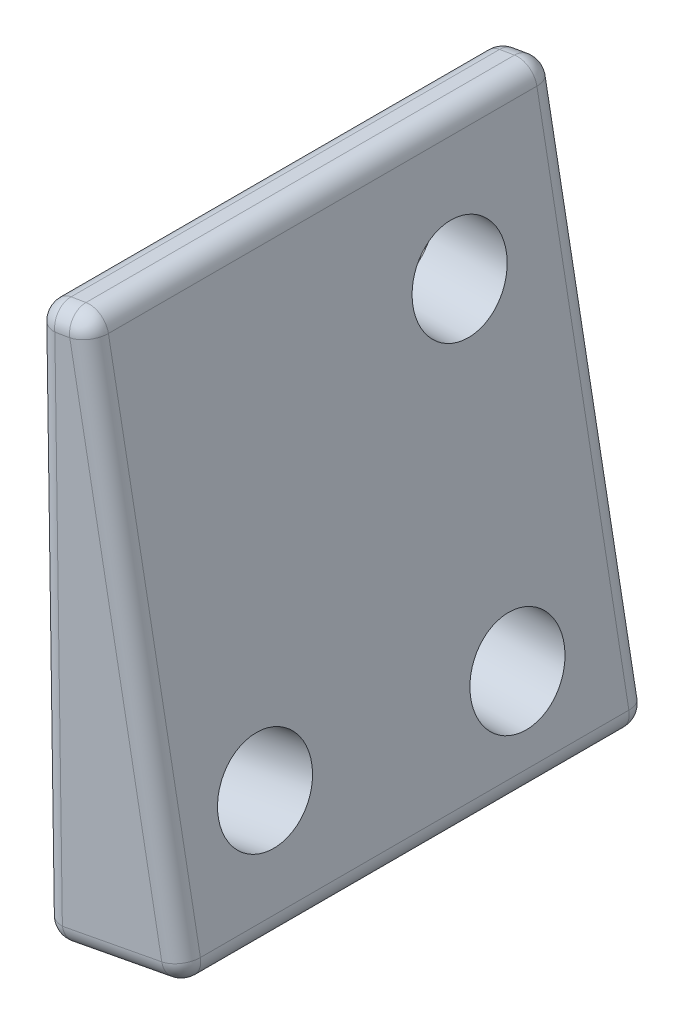
ISO-10303-21;
HEADER;
FILE_DESCRIPTION(('STEP AP214'),'2;1');
FILE_NAME('part.step','',(''),(''),'','','');
FILE_SCHEMA(('AUTOMOTIVE_DESIGN { 1 0 10303 214 1 1 1 1 }'));
ENDSEC;
DATA;
#1=APPLICATION_CONTEXT('core data for automotive mechanical design processes');
#2=APPLICATION_PROTOCOL_DEFINITION('international standard','automotive_design',2000,#1);
#3=PRODUCT_CONTEXT('',#1,'mechanical');
#4=PRODUCT('Part','Part','',(#3));
#5=PRODUCT_RELATED_PRODUCT_CATEGORY('part','',(#4));
#6=PRODUCT_DEFINITION_FORMATION('','',#4);
#7=PRODUCT_DEFINITION_CONTEXT('part definition',#1,'design');
#8=PRODUCT_DEFINITION('design','',#6,#7);
#9=PRODUCT_DEFINITION_SHAPE('','',#8);
#10=(LENGTH_UNIT() NAMED_UNIT(*) SI_UNIT(.MILLI.,.METRE.));
#11=(NAMED_UNIT(*) PLANE_ANGLE_UNIT() SI_UNIT($,.RADIAN.));
#12=(NAMED_UNIT(*) SI_UNIT($,.STERADIAN.) SOLID_ANGLE_UNIT());
#13=UNCERTAINTY_MEASURE_WITH_UNIT(LENGTH_MEASURE(1.E-05),#10,'distance_accuracy_value','');
#14=(GEOMETRIC_REPRESENTATION_CONTEXT(3) GLOBAL_UNCERTAINTY_ASSIGNED_CONTEXT((#13)) GLOBAL_UNIT_ASSIGNED_CONTEXT((#10,
#11,#12)) REPRESENTATION_CONTEXT('',''));
#15=CARTESIAN_POINT('',(0.,0.,0.));
#16=DIRECTION('',(0.,0.,1.));
#17=DIRECTION('',(1.,0.,0.));
#18=AXIS2_PLACEMENT_3D('',#15,#16,#17);
#19=CARTESIAN_POINT('',(0.,0.,9.525));
#20=DIRECTION('',(-0.186586678497619,0.982438502608294,0.));
#21=DIRECTION('',(-0.982438502608294,-0.186586678497619,0.));
#22=AXIS2_PLACEMENT_3D('',#19,#20,#21);
#23=PLANE('',#22);
#24=DIRECTION('',(0.,0.,-1.));
#25=VECTOR('',#24,1.);
#26=CARTESIAN_POINT('',(-0.776852208384602,-0.147541319747945,9.525));
#27=LINE('',#26,#25);
#28=CARTESIAN_POINT('',(-0.776852208384601,-0.147541319747945,-8.73125));
#29=VERTEX_POINT('',#28);
#30=CARTESIAN_POINT('',(-0.776852208384601,-0.147541319747945,8.73125));
#31=VERTEX_POINT('',#30);
#32=EDGE_CURVE('E220',#29,#31,#27,.F.);
#33=ORIENTED_EDGE('',*,*,#32,.T.);
#34=DIRECTION('',(0.982438502608294,0.186586678497619,0.));
#35=VECTOR('',#34,1.);
#36=CARTESIAN_POINT('',(-5.75504972665996,-1.09301051438357,8.73125));
#37=LINE('',#36,#35);
#38=CARTESIAN_POINT('',(-4.82718509807419,-0.91678861481061,8.73125));
#39=VERTEX_POINT('',#38);
#40=EDGE_CURVE('E223',#31,#39,#37,.F.);
#41=ORIENTED_EDGE('',*,*,#40,.T.);
#42=DIRECTION('',(0.,0.,-1.));
#43=VECTOR('',#42,1.);
#44=CARTESIAN_POINT('',(-4.82718509807419,-0.91678861481061,9.525));
#45=LINE('',#44,#43);
#46=CARTESIAN_POINT('',(-4.82718509807419,-0.91678861481061,-8.73125));
#47=VERTEX_POINT('',#46);
#48=EDGE_CURVE('E214',#39,#47,#45,.T.);
#49=ORIENTED_EDGE('',*,*,#48,.T.);
#50=DIRECTION('',(0.982438502608294,0.186586678497619,0.));
#51=VECTOR('',#50,1.);
#52=CARTESIAN_POINT('',(0.,0.,-8.73125));
#53=LINE('',#52,#51);
#54=EDGE_CURVE('E217',#47,#29,#53,.T.);
#55=ORIENTED_EDGE('',*,*,#54,.T.);
#56=EDGE_LOOP('',(#33,#41,#49,#55));
#57=FACE_BOUND('',#56,.T.);
#58=ADVANCED_FACE('F49',(#57),#23,.F.);
#59=CARTESIAN_POINT('',(-4.03527270589868,21.6965509629605,9.525));
#60=DIRECTION('',(-0.983140599238442,-0.182851202153765,0.));
#61=DIRECTION('',(0.182851202153765,-0.983140599238442,0.));
#62=AXIS2_PLACEMENT_3D('',#59,#60,#61);
#63=PLANE('',#62);
#64=DIRECTION('',(-0.182851202153765,0.983140599238442,0.));
#65=VECTOR('',#64,1.);
#66=CARTESIAN_POINT('',(-4.03527270589868,21.6965509629605,-8.73125));
#67=LINE('',#66,#65);
#68=CARTESIAN_POINT('',(-0.144587533796573,0.777407383406937,-8.73125));
#69=VERTEX_POINT('',#68);
#70=CARTESIAN_POINT('',(-3.89239666877288,20.9283458262037,-8.73125));
#71=VERTEX_POINT('',#70);
#72=EDGE_CURVE('E238',#69,#71,#67,.T.);
#73=ORIENTED_EDGE('',*,*,#72,.T.);
#74=DIRECTION('',(0.,0.,-1.));
#75=VECTOR('',#74,1.);
#76=CARTESIAN_POINT('',(-3.89239666877288,20.9283458262037,9.525));
#77=LINE('',#76,#75);
#78=CARTESIAN_POINT('',(-3.89239666877288,20.9283458262037,8.73125));
#79=VERTEX_POINT('',#78);
#80=EDGE_CURVE('E247',#71,#79,#77,.F.);
#81=ORIENTED_EDGE('',*,*,#80,.T.);
#82=DIRECTION('',(-0.182851202153765,0.983140599238442,0.));
#83=VECTOR('',#82,1.);
#84=CARTESIAN_POINT('',(0.,0.,8.73125));
#85=LINE('',#84,#83);
#86=CARTESIAN_POINT('',(-0.144587533796573,0.777407383406937,8.73125));
#87=VERTEX_POINT('',#86);
#88=EDGE_CURVE('E244',#79,#87,#85,.F.);
#89=ORIENTED_EDGE('',*,*,#88,.T.);
#90=DIRECTION('',(0.,0.,-1.));
#91=VECTOR('',#90,1.);
#92=CARTESIAN_POINT('',(-0.144587533796573,0.777407383406935,9.525));
#93=LINE('',#92,#91);
#94=EDGE_CURVE('E241',#87,#69,#93,.T.);
#95=ORIENTED_EDGE('',*,*,#94,.T.);
#96=EDGE_LOOP('',(#73,#81,#89,#95));
#97=FACE_BOUND('',#96,.T.);
#98=CARTESIAN_POINT('',(-0.862804348530857,4.63906156617351,5.37860381234904));
#99=DIRECTION('',(0.983140599238442,0.182851202153766,0.));
#100=DIRECTION('',(-0.182851202153766,0.983140599238442,0.));
#101=AXIS2_PLACEMENT_3D('',#98,#99,#100);
#102=CIRCLE('',#101,1.905);
#103=CARTESIAN_POINT('',(-1.21113588863378,6.51194440772274,5.37860381234904));
#104=VERTEX_POINT('',#103);
#105=EDGE_CURVE('E348',#104,#104,#102,.T.);
#106=ORIENTED_EDGE('',*,*,#105,.F.);
#107=EDGE_LOOP('',(#106));
#108=FACE_BOUND('',#107,.T.);
#109=CARTESIAN_POINT('',(-0.71672777584938,3.85364803041786,-4.7625));
#110=DIRECTION('',(-0.983140599238442,-0.182851202153765,0.));
#111=DIRECTION('',(-0.182851202153765,0.983140599238442,0.));
#112=AXIS2_PLACEMENT_3D('',#109,#110,#111);
#113=ELLIPSE('',#112,1.93258633249918,1.905);
#114=CARTESIAN_POINT('',(-1.07010351001279,5.75365211543113,-4.7625));
#115=VERTEX_POINT('',#114);
#116=EDGE_CURVE('E201',#115,#115,#113,.T.);
#117=ORIENTED_EDGE('',*,*,#116,.T.);
#118=EDGE_LOOP('',(#117));
#119=FACE_BOUND('',#118,.T.);
#120=CARTESIAN_POINT('',(-3.07256600360546,16.5203419305063,-4.7625));
#121=DIRECTION('',(-0.983140599238442,-0.182851202153765,0.));
#122=DIRECTION('',(-0.182851202153765,0.983140599238442,0.));
#123=AXIS2_PLACEMENT_3D('',#120,#121,#122);
#124=ELLIPSE('',#123,1.93258633249918,1.905);
#125=CARTESIAN_POINT('',(-3.42594173776887,18.4203460155196,-4.7625));
#126=VERTEX_POINT('',#125);
#127=EDGE_CURVE('E205',#126,#126,#124,.T.);
#128=ORIENTED_EDGE('',*,*,#127,.T.);
#129=EDGE_LOOP('',(#128));
#130=FACE_BOUND('',#129,.T.);
#131=ADVANCED_FACE('F373',(#97,#108,#119,#130),#63,.F.);
#132=CARTESIAN_POINT('',(-6.08542968309798,21.3484721947888,9.525));
#133=DIRECTION('',(0.16738614290036,-0.985891413475612,0.));
#134=DIRECTION('',(0.985891413475612,0.16738614290036,0.));
#135=AXIS2_PLACEMENT_3D('',#132,#133,#134);
#136=PLANE('',#135);
#137=DIRECTION('',(0.,0.,-1.));
#138=VECTOR('',#137,1.);
#139=CARTESIAN_POINT('',(-5.41461253164299,21.4623645505175,9.525));
#140=LINE('',#139,#138);
#141=CARTESIAN_POINT('',(-5.41461253164299,21.4623645505175,-8.73125));
#142=VERTEX_POINT('',#141);
#143=CARTESIAN_POINT('',(-5.41461253164299,21.4623645505175,8.73125));
#144=VERTEX_POINT('',#143);
#145=EDGE_CURVE('E227',#142,#144,#140,.F.);
#146=ORIENTED_EDGE('',*,*,#145,.T.);
#147=DIRECTION('',(-0.985891413475612,-0.16738614290036,0.));
#148=VECTOR('',#147,1.);
#149=CARTESIAN_POINT('',(-4.03527270589868,21.6965509629605,8.73125));
#150=LINE('',#149,#148);
#151=CARTESIAN_POINT('',(-4.80562727034556,21.5657589939404,8.73125));
#152=VERTEX_POINT('',#151);
#153=EDGE_CURVE('E180',#144,#152,#150,.F.);
#154=ORIENTED_EDGE('',*,*,#153,.T.);
#155=DIRECTION('',(0.,0.,-1.));
#156=VECTOR('',#155,1.);
#157=CARTESIAN_POINT('',(-4.80562727034556,21.5657589939404,9.525));
#158=LINE('',#157,#156);
#159=CARTESIAN_POINT('',(-4.80562727034556,21.5657589939404,-8.73125));
#160=VERTEX_POINT('',#159);
#161=EDGE_CURVE('E233',#152,#160,#158,.T.);
#162=ORIENTED_EDGE('',*,*,#161,.T.);
#163=DIRECTION('',(-0.985891413475612,-0.16738614290036,0.));
#164=VECTOR('',#163,1.);
#165=CARTESIAN_POINT('',(-6.08542968309798,21.3484721947888,-8.73125));
#166=LINE('',#165,#164);
#167=EDGE_CURVE('E230',#160,#142,#166,.T.);
#168=ORIENTED_EDGE('',*,*,#167,.T.);
#169=EDGE_LOOP('',(#146,#154,#162,#168));
#170=FACE_BOUND('',#169,.T.);
#171=ADVANCED_FACE('F400',(#170),#136,.F.);
#172=CARTESIAN_POINT('',(-5.75504972665996,-1.09301051438357,9.525));
#173=DIRECTION('',(0.999891651299871,0.0147202466289882,0.));
#174=DIRECTION('',(-0.0147202466289882,0.999891651299871,0.));
#175=AXIS2_PLACEMENT_3D('',#172,#173,#174);
#176=PLANE('',#175);
#177=DIRECTION('',(0.,0.,-1.));
#178=VECTOR('',#177,1.);
#179=CARTESIAN_POINT('',(-5.76895227235095,-0.148662249127036,9.525));
#180=LINE('',#179,#178);
#181=CARTESIAN_POINT('',(-5.76895227235095,-0.148662249127036,-8.73125));
#182=VERTEX_POINT('',#181);
#183=CARTESIAN_POINT('',(-5.76895227235095,-0.148662249127036,8.73125));
#184=VERTEX_POINT('',#183);
#185=EDGE_CURVE('E59',#182,#184,#180,.F.);
#186=ORIENTED_EDGE('',*,*,#185,.T.);
#187=DIRECTION('',(0.0147202466289882,-0.999891651299871,0.));
#188=VECTOR('',#187,1.);
#189=CARTESIAN_POINT('',(-6.08542968309798,21.3484721947888,8.73125));
#190=LINE('',#189,#188);
#191=CARTESIAN_POINT('',(-6.07541377893511,20.6681290453095,8.73125));
#192=VERTEX_POINT('',#191);
#193=EDGE_CURVE('E11',#184,#192,#190,.F.);
#194=ORIENTED_EDGE('',*,*,#193,.T.);
#195=DIRECTION('',(0.,0.,-1.));
#196=VECTOR('',#195,1.);
#197=CARTESIAN_POINT('',(-6.07541377893511,20.6681290453095,9.525));
#198=LINE('',#197,#196);
#199=CARTESIAN_POINT('',(-6.07541377893511,20.6681290453095,-8.73125));
#200=VERTEX_POINT('',#199);
#201=EDGE_CURVE('E264',#192,#200,#198,.T.);
#202=ORIENTED_EDGE('',*,*,#201,.T.);
#203=DIRECTION('',(0.0147202466289882,-0.999891651299871,0.));
#204=VECTOR('',#203,1.);
#205=CARTESIAN_POINT('',(-5.75504972665996,-1.09301051438357,-8.73125));
#206=LINE('',#205,#204);
#207=EDGE_CURVE('E75',#200,#182,#206,.T.);
#208=ORIENTED_EDGE('',*,*,#207,.T.);
#209=EDGE_LOOP('',(#186,#194,#202,#208));
#210=FACE_BOUND('',#209,.T.);
#211=CARTESIAN_POINT('',(-5.82584723241965,3.7160009598241,5.37860381234904));
#212=DIRECTION('',(0.999891651299871,0.0147202466289882,0.));
#213=DIRECTION('',(-0.0147202466289882,0.999891651299871,0.));
#214=AXIS2_PLACEMENT_3D('',#211,#212,#213);
#215=ELLIPSE('',#214,1.93258633249918,1.905);
#216=CARTESIAN_POINT('',(-5.85429537986585,5.64837789910626,5.37860381234904));
#217=VERTEX_POINT('',#216);
#218=EDGE_CURVE('E208',#217,#217,#215,.T.);
#219=ORIENTED_EDGE('',*,*,#218,.T.);
#220=EDGE_LOOP('',(#219));
#221=FACE_BOUND('',#220,.T.);
#222=CARTESIAN_POINT('',(-5.8267661387849,3.77841885444843,-4.7625));
#223=DIRECTION('',(-0.99989165129987,-0.0147202466289882,0.));
#224=DIRECTION('',(0.0147202466289882,-0.99989165129987,0.));
#225=AXIS2_PLACEMENT_3D('',#222,#223,#224);
#226=CIRCLE('',#225,1.905);
#227=CARTESIAN_POINT('',(-5.79872406895667,1.87362525872218,-4.7625));
#228=VERTEX_POINT('',#227);
#229=EDGE_CURVE('E362',#228,#228,#226,.T.);
#230=ORIENTED_EDGE('',*,*,#229,.F.);
#231=EDGE_LOOP('',(#230));
#232=FACE_BOUND('',#231,.T.);
#233=CARTESIAN_POINT('',(-6.01371327097305,16.4770428259568,-4.7625));
#234=DIRECTION('',(-0.99989165129987,-0.0147202466289882,0.));
#235=DIRECTION('',(0.0147202466289882,-0.99989165129987,0.));
#236=AXIS2_PLACEMENT_3D('',#233,#234,#235);
#237=CIRCLE('',#236,1.905);
#238=CARTESIAN_POINT('',(-5.98567120114482,14.5722492302305,-4.7625));
#239=VERTEX_POINT('',#238);
#240=EDGE_CURVE('E360',#239,#239,#237,.T.);
#241=ORIENTED_EDGE('',*,*,#240,.F.);
#242=EDGE_LOOP('',(#241));
#243=FACE_BOUND('',#242,.T.);
#244=ADVANCED_FACE('F506',(#210,#221,#232,#243),#176,.F.);
#245=CARTESIAN_POINT('',(0.,0.,9.525));
#246=DIRECTION('',(0.,0.,1.));
#247=DIRECTION('',(1.,0.,0.));
#248=AXIS2_PLACEMENT_3D('',#245,#246,#247);
#249=PLANE('',#248);
#250=DIRECTION('',(0.982438502608294,0.186586678497619,0.));
#251=VECTOR('',#250,1.);
#252=CARTESIAN_POINT('',(-0.148103176057485,0.779810561445333,9.525));
#253=LINE('',#252,#251);
#254=CARTESIAN_POINT('',(-4.97528827413168,-0.136978053365276,9.525));
#255=VERTEX_POINT('',#254);
#256=CARTESIAN_POINT('',(-0.924955384442086,0.632269241697388,9.525));
#257=VERTEX_POINT('',#256);
#258=EDGE_CURVE('E172',#255,#257,#253,.T.);
#259=ORIENTED_EDGE('',*,*,#258,.T.);
#260=DIRECTION('',(-0.182851202153765,0.983140599238442,0.));
#261=VECTOR('',#260,1.);
#262=CARTESIAN_POINT('',(-4.8156405565442,21.5514128212509,9.525));
#263=LINE('',#262,#261);
#264=CARTESIAN_POINT('',(-4.67276451941839,20.7832076844942,9.525));
#265=VERTEX_POINT('',#264);
#266=EDGE_CURVE('E167',#257,#265,#263,.T.);
#267=ORIENTED_EDGE('',*,*,#266,.T.);
#268=DIRECTION('',(-0.985891413475612,-0.16738614290036,0.));
#269=VECTOR('',#268,1.);
#270=CARTESIAN_POINT('',(-5.95256693217082,20.5659208853425,9.525));
#271=LINE('',#270,#269);
#272=CARTESIAN_POINT('',(-5.28174978071583,20.6798132410712,9.525));
#273=VERTEX_POINT('',#272);
#274=EDGE_CURVE('E159',#265,#273,#271,.T.);
#275=ORIENTED_EDGE('',*,*,#274,.T.);
#276=DIRECTION('',(0.0147202466289882,-0.99989165129987,0.));
#277=VECTOR('',#276,1.);
#278=CARTESIAN_POINT('',(-4.96138572844069,-1.08132631862181,9.525));
#279=LINE('',#278,#277);
#280=EDGE_CURVE('E164',#273,#255,#279,.T.);
#281=ORIENTED_EDGE('',*,*,#280,.T.);
#282=EDGE_LOOP('',(#259,#267,#275,#281));
#283=FACE_BOUND('',#282,.T.);
#284=ADVANCED_FACE('F162',(#283),#249,.T.);
#285=CARTESIAN_POINT('',(0.,0.,-9.525));
#286=DIRECTION('',(0.,0.,1.));
#287=DIRECTION('',(1.,0.,0.));
#288=AXIS2_PLACEMENT_3D('',#285,#286,#287);
#289=PLANE('',#288);
#290=DIRECTION('',(-0.985891413475612,-0.16738614290036,0.));
#291=VECTOR('',#290,1.);
#292=CARTESIAN_POINT('',(-3.56066180566553,20.972022173818,-9.525));
#293=LINE('',#292,#291);
#294=CARTESIAN_POINT('',(-5.28174978071583,20.6798132410712,-9.525));
#295=VERTEX_POINT('',#294);
#296=CARTESIAN_POINT('',(-4.67276451941839,20.7832076844942,-9.525));
#297=VERTEX_POINT('',#296);
#298=EDGE_CURVE('E257',#295,#297,#293,.F.);
#299=ORIENTED_EDGE('',*,*,#298,.T.);
#300=DIRECTION('',(-0.182851202153765,0.983140599238442,0.));
#301=VECTOR('',#300,1.);
#302=CARTESIAN_POINT('',(-0.780367850645513,-0.145138141709551,-9.525));
#303=LINE('',#302,#301);
#304=CARTESIAN_POINT('',(-0.924955384442087,0.632269241697387,-9.525));
#305=VERTEX_POINT('',#304);
#306=EDGE_CURVE('E261',#297,#305,#303,.F.);
#307=ORIENTED_EDGE('',*,*,#306,.T.);
#308=DIRECTION('',(0.982438502608294,0.186586678497619,0.));
#309=VECTOR('',#308,1.);
#310=CARTESIAN_POINT('',(-0.148103176057485,0.779810561445333,-9.525));
#311=LINE('',#310,#309);
#312=CARTESIAN_POINT('',(-4.97528827413168,-0.136978053365276,-9.525));
#313=VERTEX_POINT('',#312);
#314=EDGE_CURVE('E254',#305,#313,#311,.F.);
#315=ORIENTED_EDGE('',*,*,#314,.T.);
#316=DIRECTION('',(0.0147202466289882,-0.99989165129987,0.));
#317=VECTOR('',#316,1.);
#318=CARTESIAN_POINT('',(-4.97622633276355,-0.0732592164408187,-9.525));
#319=LINE('',#318,#317);
#320=EDGE_CURVE('E251',#313,#295,#319,.F.);
#321=ORIENTED_EDGE('',*,*,#320,.T.);
#322=EDGE_LOOP('',(#299,#307,#315,#321));
#323=FACE_BOUND('',#322,.T.);
#324=ADVANCED_FACE('F378',(#323),#289,.F.);
#325=CARTESIAN_POINT('',(0.0755210369288457,16.5666875696423,-4.7625));
#326=DIRECTION('',(-0.99989165129987,-0.0147202466289882,0.));
#327=DIRECTION('',(0.0147202466289882,-0.99989165129987,0.));
#328=AXIS2_PLACEMENT_3D('',#325,#326,#327);
#329=CYLINDRICAL_SURFACE('',#328,1.905);
#330=ORIENTED_EDGE('',*,*,#240,.T.);
#331=EDGE_LOOP('',(#330));
#332=FACE_BOUND('',#331,.T.);
#333=ORIENTED_EDGE('',*,*,#127,.F.);
#334=EDGE_LOOP('',(#333));
#335=FACE_BOUND('',#334,.T.);
#336=ADVANCED_FACE('F375',(#332,#335),#329,.F.);
#337=CARTESIAN_POINT('',(0.262468169116995,3.8680635981339,-4.7625));
#338=DIRECTION('',(-0.99989165129987,-0.0147202466289882,0.));
#339=DIRECTION('',(0.0147202466289882,-0.99989165129987,0.));
#340=AXIS2_PLACEMENT_3D('',#337,#338,#339);
#341=CYLINDRICAL_SURFACE('',#340,1.905);
#342=ORIENTED_EDGE('',*,*,#229,.T.);
#343=EDGE_LOOP('',(#342));
#344=FACE_BOUND('',#343,.T.);
#345=ORIENTED_EDGE('',*,*,#116,.F.);
#346=EDGE_LOOP('',(#345));
#347=FACE_BOUND('',#346,.T.);
#348=ADVANCED_FACE('F377',(#344,#347),#341,.F.);
#349=CARTESIAN_POINT('',(-6.94125915038092,3.50854903458183,5.37860381234904));
#350=DIRECTION('',(0.983140599238442,0.182851202153766,0.));
#351=DIRECTION('',(-0.182851202153766,0.983140599238442,0.));
#352=AXIS2_PLACEMENT_3D('',#349,#350,#351);
#353=CYLINDRICAL_SURFACE('',#352,1.905);
#354=ORIENTED_EDGE('',*,*,#105,.T.);
#355=EDGE_LOOP('',(#354));
#356=FACE_BOUND('',#355,.T.);
#357=ORIENTED_EDGE('',*,*,#218,.F.);
#358=EDGE_LOOP('',(#357));
#359=FACE_BOUND('',#358,.T.);
#360=ADVANCED_FACE('F385',(#356,#359),#353,.F.);
#361=CARTESIAN_POINT('',(-5.95256693217082,20.5659208853425,-8.73125));
#362=DIRECTION('',(-0.985891413475612,-0.16738614290036,0.));
#363=DIRECTION('',(0.16738614290036,-0.985891413475612,0.));
#364=AXIS2_PLACEMENT_3D('',#361,#362,#363);
#365=CYLINDRICAL_SURFACE('',#364,0.79375);
#366=CARTESIAN_POINT('',(-5.28174978071583,20.6798132410712,-8.73125));
#367=DIRECTION('',(-0.985891413475612,-0.16738614290036,0.));
#368=DIRECTION('',(0.16738614290036,-0.985891413475612,0.));
#369=AXIS2_PLACEMENT_3D('',#366,#367,#368);
#370=CIRCLE('',#369,0.79375);
#371=EDGE_CURVE('E53',#142,#295,#370,.T.);
#372=ORIENTED_EDGE('',*,*,#371,.F.);
#373=ORIENTED_EDGE('',*,*,#167,.F.);
#374=CARTESIAN_POINT('',(-4.67276451941839,20.7832076844942,-8.73125));
#375=DIRECTION('',(0.985891413475612,0.16738614290036,0.));
#376=DIRECTION('',(-0.16738614290036,0.985891413475612,0.));
#377=AXIS2_PLACEMENT_3D('',#374,#375,#376);
#378=CIRCLE('',#377,0.79375);
#379=EDGE_CURVE('E339',#297,#160,#378,.T.);
#380=ORIENTED_EDGE('',*,*,#379,.F.);
#381=ORIENTED_EDGE('',*,*,#298,.F.);
#382=EDGE_LOOP('',(#372,#373,#380,#381));
#383=FACE_BOUND('',#382,.T.);
#384=ADVANCED_FACE('F51',(#383),#365,.T.);
#385=CARTESIAN_POINT('',(-5.28174978071583,20.6798132410712,-8.73125));
#386=DIRECTION('',(0.,0.,-1.));
#387=DIRECTION('',(-1.,0.,0.));
#388=AXIS2_PLACEMENT_3D('',#385,#386,#387);
#389=SPHERICAL_SURFACE('',#388,0.79375);
#390=CARTESIAN_POINT('',(-5.28174978071583,20.6798132410712,-8.73125));
#391=DIRECTION('',(0.,0.,-1.));
#392=DIRECTION('',(-1.,0.,0.));
#393=AXIS2_PLACEMENT_3D('',#390,#391,#392);
#394=CIRCLE('',#393,0.79375);
#395=EDGE_CURVE('E332',#142,#200,#394,.F.);
#396=ORIENTED_EDGE('',*,*,#395,.F.);
#397=ORIENTED_EDGE('',*,*,#371,.T.);
#398=CARTESIAN_POINT('',(-5.28174978071583,20.6798132410712,-8.73125));
#399=DIRECTION('',(-0.0147202466289832,0.99989165129987,0.));
#400=DIRECTION('',(-0.999891651299871,-0.0147202466289832,0.));
#401=AXIS2_PLACEMENT_3D('',#398,#399,#400);
#402=CIRCLE('',#401,0.79375);
#403=EDGE_CURVE('E336',#200,#295,#402,.F.);
#404=ORIENTED_EDGE('',*,*,#403,.F.);
#405=EDGE_LOOP('',(#396,#397,#404));
#406=FACE_BOUND('',#405,.T.);
#407=ADVANCED_FACE('F469',(#406),#389,.T.);
#408=CARTESIAN_POINT('',(-4.67276451941839,20.7832076844942,-8.73125));
#409=DIRECTION('',(0.,0.,-1.));
#410=DIRECTION('',(-1.,0.,0.));
#411=AXIS2_PLACEMENT_3D('',#408,#409,#410);
#412=SPHERICAL_SURFACE('',#411,0.79375);
#413=CARTESIAN_POINT('',(-4.67276451941839,20.7832076844942,-8.73125));
#414=DIRECTION('',(-0.182851202153764,0.983140599238442,0.));
#415=DIRECTION('',(-0.983140599238442,-0.182851202153764,0.));
#416=AXIS2_PLACEMENT_3D('',#413,#414,#415);
#417=CIRCLE('',#416,0.79375);
#418=EDGE_CURVE('E324',#297,#71,#417,.F.);
#419=ORIENTED_EDGE('',*,*,#418,.F.);
#420=ORIENTED_EDGE('',*,*,#379,.T.);
#421=CARTESIAN_POINT('',(-4.67276451941839,20.7832076844942,-8.73125));
#422=DIRECTION('',(0.,0.,-1.));
#423=DIRECTION('',(-1.,0.,0.));
#424=AXIS2_PLACEMENT_3D('',#421,#422,#423);
#425=CIRCLE('',#424,0.79375);
#426=EDGE_CURVE('E328',#71,#160,#425,.F.);
#427=ORIENTED_EDGE('',*,*,#426,.F.);
#428=EDGE_LOOP('',(#419,#420,#427));
#429=FACE_BOUND('',#428,.T.);
#430=ADVANCED_FACE('F466',(#429),#412,.T.);
#431=CARTESIAN_POINT('',(-4.96138572844069,-1.08132631862181,-8.73125));
#432=DIRECTION('',(0.0147202466289882,-0.99989165129987,0.));
#433=DIRECTION('',(0.99989165129987,0.0147202466289882,0.));
#434=AXIS2_PLACEMENT_3D('',#431,#432,#433);
#435=CYLINDRICAL_SURFACE('',#434,0.79375);
#436=ORIENTED_EDGE('',*,*,#403,.T.);
#437=ORIENTED_EDGE('',*,*,#320,.F.);
#438=CARTESIAN_POINT('',(-4.97528827413168,-0.136978053365277,-8.73125));
#439=DIRECTION('',(0.0147202466289882,-0.99989165129987,0.));
#440=DIRECTION('',(0.99989165129987,0.0147202466289882,0.));
#441=AXIS2_PLACEMENT_3D('',#438,#439,#440);
#442=CIRCLE('',#441,0.79375);
#443=EDGE_CURVE('E316',#182,#313,#442,.T.);
#444=ORIENTED_EDGE('',*,*,#443,.F.);
#445=ORIENTED_EDGE('',*,*,#207,.F.);
#446=EDGE_LOOP('',(#436,#437,#444,#445));
#447=FACE_BOUND('',#446,.T.);
#448=ADVANCED_FACE('F462',(#447),#435,.T.);
#449=CARTESIAN_POINT('',(-5.28174978071583,20.6798132410712,9.525));
#450=DIRECTION('',(0.,0.,-1.));
#451=DIRECTION('',(-1.,0.,0.));
#452=AXIS2_PLACEMENT_3D('',#449,#450,#451);
#453=CYLINDRICAL_SURFACE('',#452,0.79375);
#454=ORIENTED_EDGE('',*,*,#395,.T.);
#455=ORIENTED_EDGE('',*,*,#201,.F.);
#456=CARTESIAN_POINT('',(-5.28174978071583,20.6798132410712,8.73125));
#457=DIRECTION('',(0.,0.,1.));
#458=DIRECTION('',(1.,0.,0.));
#459=AXIS2_PLACEMENT_3D('',#456,#457,#458);
#460=CIRCLE('',#459,0.79375);
#461=EDGE_CURVE('E185',#144,#192,#460,.T.);
#462=ORIENTED_EDGE('',*,*,#461,.F.);
#463=ORIENTED_EDGE('',*,*,#145,.F.);
#464=EDGE_LOOP('',(#454,#455,#462,#463));
#465=FACE_BOUND('',#464,.T.);
#466=ADVANCED_FACE('F459',(#465),#453,.T.);
#467=CARTESIAN_POINT('',(-3.56066180566553,20.972022173818,8.73125));
#468=DIRECTION('',(0.985891413475612,0.16738614290036,0.));
#469=DIRECTION('',(-0.16738614290036,0.985891413475612,0.));
#470=AXIS2_PLACEMENT_3D('',#467,#468,#469);
#471=CYLINDRICAL_SURFACE('',#470,0.79375);
#472=CARTESIAN_POINT('',(-4.67276451941839,20.7832076844942,8.73125));
#473=DIRECTION('',(0.985891413475612,0.16738614290036,0.));
#474=DIRECTION('',(-0.16738614290036,0.985891413475612,0.));
#475=AXIS2_PLACEMENT_3D('',#472,#473,#474);
#476=CIRCLE('',#475,0.79375);
#477=EDGE_CURVE('E186',#152,#265,#476,.T.);
#478=ORIENTED_EDGE('',*,*,#477,.F.);
#479=ORIENTED_EDGE('',*,*,#153,.F.);
#480=CARTESIAN_POINT('',(-5.28174978071583,20.6798132410712,8.73125));
#481=DIRECTION('',(-0.985891413475612,-0.16738614290036,0.));
#482=DIRECTION('',(0.16738614290036,-0.985891413475612,0.));
#483=AXIS2_PLACEMENT_3D('',#480,#481,#482);
#484=CIRCLE('',#483,0.79375);
#485=EDGE_CURVE('E176',#273,#144,#484,.T.);
#486=ORIENTED_EDGE('',*,*,#485,.F.);
#487=ORIENTED_EDGE('',*,*,#274,.F.);
#488=EDGE_LOOP('',(#478,#479,#486,#487));
#489=FACE_BOUND('',#488,.T.);
#490=ADVANCED_FACE('F178',(#489),#471,.T.);
#491=CARTESIAN_POINT('',(-4.67276451941839,20.7832076844942,9.525));
#492=DIRECTION('',(0.,0.,-1.));
#493=DIRECTION('',(-1.,0.,0.));
#494=AXIS2_PLACEMENT_3D('',#491,#492,#493);
#495=CYLINDRICAL_SURFACE('',#494,0.79375);
#496=ORIENTED_EDGE('',*,*,#426,.T.);
#497=ORIENTED_EDGE('',*,*,#161,.F.);
#498=CARTESIAN_POINT('',(-4.67276451941839,20.7832076844942,8.73125));
#499=DIRECTION('',(0.,0.,1.));
#500=DIRECTION('',(1.,0.,0.));
#501=AXIS2_PLACEMENT_3D('',#498,#499,#500);
#502=CIRCLE('',#501,0.79375);
#503=EDGE_CURVE('E309',#79,#152,#502,.T.);
#504=ORIENTED_EDGE('',*,*,#503,.F.);
#505=ORIENTED_EDGE('',*,*,#80,.F.);
#506=EDGE_LOOP('',(#496,#497,#504,#505));
#507=FACE_BOUND('',#506,.T.);
#508=ADVANCED_FACE('F452',(#507),#495,.T.);
#509=CARTESIAN_POINT('',(-4.8156405565442,21.5514128212509,-8.73125));
#510=DIRECTION('',(-0.182851202153765,0.983140599238442,0.));
#511=DIRECTION('',(-0.983140599238442,-0.182851202153765,0.));
#512=AXIS2_PLACEMENT_3D('',#509,#510,#511);
#513=CYLINDRICAL_SURFACE('',#512,0.79375);
#514=ORIENTED_EDGE('',*,*,#418,.T.);
#515=ORIENTED_EDGE('',*,*,#72,.F.);
#516=CARTESIAN_POINT('',(-0.924955384442087,0.632269241697387,-8.73125));
#517=DIRECTION('',(0.182851202153763,-0.983140599238442,0.));
#518=DIRECTION('',(0.983140599238442,0.182851202153763,0.));
#519=AXIS2_PLACEMENT_3D('',#516,#517,#518);
#520=CIRCLE('',#519,0.79375);
#521=EDGE_CURVE('E305',#305,#69,#520,.T.);
#522=ORIENTED_EDGE('',*,*,#521,.F.);
#523=ORIENTED_EDGE('',*,*,#306,.F.);
#524=EDGE_LOOP('',(#514,#515,#522,#523));
#525=FACE_BOUND('',#524,.T.);
#526=ADVANCED_FACE('F448',(#525),#513,.T.);
#527=CARTESIAN_POINT('',(-0.148103176057485,0.779810561445333,-8.73125));
#528=DIRECTION('',(0.982438502608294,0.186586678497619,0.));
#529=DIRECTION('',(-0.186586678497619,0.982438502608294,0.));
#530=AXIS2_PLACEMENT_3D('',#527,#528,#529);
#531=CYLINDRICAL_SURFACE('',#530,0.79375);
#532=CARTESIAN_POINT('',(-4.97528827413168,-0.136978053365276,-8.73125));
#533=DIRECTION('',(-0.982438502608294,-0.186586678497617,0.));
#534=DIRECTION('',(0.186586678497617,-0.982438502608294,0.));
#535=AXIS2_PLACEMENT_3D('',#532,#533,#534);
#536=CIRCLE('',#535,0.79375);
#537=EDGE_CURVE('E320',#313,#47,#536,.T.);
#538=ORIENTED_EDGE('',*,*,#537,.F.);
#539=ORIENTED_EDGE('',*,*,#314,.F.);
#540=CARTESIAN_POINT('',(-0.924955384442087,0.632269241697388,-8.73125));
#541=DIRECTION('',(0.982438502608294,0.186586678497619,0.));
#542=DIRECTION('',(-0.186586678497619,0.982438502608294,0.));
#543=AXIS2_PLACEMENT_3D('',#540,#541,#542);
#544=CIRCLE('',#543,0.79375);
#545=EDGE_CURVE('E301',#29,#305,#544,.T.);
#546=ORIENTED_EDGE('',*,*,#545,.F.);
#547=ORIENTED_EDGE('',*,*,#54,.F.);
#548=EDGE_LOOP('',(#538,#539,#546,#547));
#549=FACE_BOUND('',#548,.T.);
#550=ADVANCED_FACE('F444',(#549),#531,.T.);
#551=CARTESIAN_POINT('',(-4.97528827413168,-0.136978053365277,-8.73125));
#552=DIRECTION('',(0.,0.,-1.));
#553=DIRECTION('',(0.,1.,0.));
#554=AXIS2_PLACEMENT_3D('',#551,#552,#553);
#555=SPHERICAL_SURFACE('',#554,0.79375);
#556=ORIENTED_EDGE('',*,*,#443,.T.);
#557=ORIENTED_EDGE('',*,*,#537,.T.);
#558=CARTESIAN_POINT('',(-4.97528827413168,-0.136978053365277,-8.73125));
#559=DIRECTION('',(0.,0.,-1.));
#560=DIRECTION('',(-1.,0.,0.));
#561=AXIS2_PLACEMENT_3D('',#558,#559,#560);
#562=CIRCLE('',#561,0.79375);
#563=EDGE_CURVE('E193',#182,#47,#562,.F.);
#564=ORIENTED_EDGE('',*,*,#563,.F.);
#565=EDGE_LOOP('',(#556,#557,#564));
#566=FACE_BOUND('',#565,.T.);
#567=ADVANCED_FACE('F441',(#566),#555,.T.);
#568=CARTESIAN_POINT('',(-5.28174978071583,20.6798132410712,8.73125));
#569=DIRECTION('',(0.,0.,1.));
#570=DIRECTION('',(1.,0.,0.));
#571=AXIS2_PLACEMENT_3D('',#568,#569,#570);
#572=SPHERICAL_SURFACE('',#571,0.79375);
#573=ORIENTED_EDGE('',*,*,#485,.T.);
#574=ORIENTED_EDGE('',*,*,#461,.T.);
#575=CARTESIAN_POINT('',(-5.28174978071583,20.6798132410712,8.73125));
#576=DIRECTION('',(-0.0147202466289876,0.99989165129987,0.));
#577=DIRECTION('',(-0.99989165129987,-0.0147202466289876,0.));
#578=AXIS2_PLACEMENT_3D('',#575,#576,#577);
#579=CIRCLE('',#578,0.79375);
#580=EDGE_CURVE('E188',#273,#192,#579,.F.);
#581=ORIENTED_EDGE('',*,*,#580,.F.);
#582=EDGE_LOOP('',(#573,#574,#581));
#583=FACE_BOUND('',#582,.T.);
#584=ADVANCED_FACE('F189',(#583),#572,.T.);
#585=CARTESIAN_POINT('',(-4.67276451941839,20.7832076844942,8.73125));
#586=DIRECTION('',(0.,0.,1.));
#587=DIRECTION('',(1.,0.,0.));
#588=AXIS2_PLACEMENT_3D('',#585,#586,#587);
#589=SPHERICAL_SURFACE('',#588,0.79375);
#590=ORIENTED_EDGE('',*,*,#503,.T.);
#591=ORIENTED_EDGE('',*,*,#477,.T.);
#592=CARTESIAN_POINT('',(-4.67276451941839,20.7832076844942,8.73125));
#593=DIRECTION('',(-0.182851202153764,0.983140599238442,0.));
#594=DIRECTION('',(-0.983140599238442,-0.182851202153764,0.));
#595=AXIS2_PLACEMENT_3D('',#592,#593,#594);
#596=CIRCLE('',#595,0.79375);
#597=EDGE_CURVE('E194',#79,#265,#596,.F.);
#598=ORIENTED_EDGE('',*,*,#597,.F.);
#599=EDGE_LOOP('',(#590,#591,#598));
#600=FACE_BOUND('',#599,.T.);
#601=ADVANCED_FACE('F434',(#600),#589,.T.);
#602=CARTESIAN_POINT('',(-0.924955384442086,0.632269241697388,-8.73125));
#603=DIRECTION('',(0.,0.,-1.));
#604=DIRECTION('',(-1.,0.,0.));
#605=AXIS2_PLACEMENT_3D('',#602,#603,#604);
#606=SPHERICAL_SURFACE('',#605,0.79375);
#607=ORIENTED_EDGE('',*,*,#545,.T.);
#608=ORIENTED_EDGE('',*,*,#521,.T.);
#609=CARTESIAN_POINT('',(-0.924955384442086,0.632269241697386,-8.73125));
#610=DIRECTION('',(0.,0.,-1.));
#611=DIRECTION('',(-1.,0.,0.));
#612=AXIS2_PLACEMENT_3D('',#609,#610,#611);
#613=CIRCLE('',#612,0.79375);
#614=EDGE_CURVE('E291',#29,#69,#613,.F.);
#615=ORIENTED_EDGE('',*,*,#614,.F.);
#616=EDGE_LOOP('',(#607,#608,#615));
#617=FACE_BOUND('',#616,.T.);
#618=ADVANCED_FACE('F430',(#617),#606,.T.);
#619=CARTESIAN_POINT('',(-4.97528827413168,-0.136978053365277,9.525));
#620=DIRECTION('',(0.,0.,-1.));
#621=DIRECTION('',(-1.,0.,0.));
#622=AXIS2_PLACEMENT_3D('',#619,#620,#621);
#623=CYLINDRICAL_SURFACE('',#622,0.79375);
#624=ORIENTED_EDGE('',*,*,#563,.T.);
#625=ORIENTED_EDGE('',*,*,#48,.F.);
#626=CARTESIAN_POINT('',(-4.97528827413168,-0.136978053365277,8.73125));
#627=DIRECTION('',(0.,0.,1.));
#628=DIRECTION('',(1.,0.,0.));
#629=AXIS2_PLACEMENT_3D('',#626,#627,#628);
#630=CIRCLE('',#629,0.79375);
#631=EDGE_CURVE('E287',#184,#39,#630,.T.);
#632=ORIENTED_EDGE('',*,*,#631,.F.);
#633=ORIENTED_EDGE('',*,*,#185,.F.);
#634=EDGE_LOOP('',(#624,#625,#632,#633));
#635=FACE_BOUND('',#634,.T.);
#636=ADVANCED_FACE('F427',(#635),#623,.T.);
#637=CARTESIAN_POINT('',(-4.97622633276355,-0.0732592164408187,8.73125));
#638=DIRECTION('',(-0.0147202466289882,0.99989165129987,0.));
#639=DIRECTION('',(-0.99989165129987,-0.0147202466289882,0.));
#640=AXIS2_PLACEMENT_3D('',#637,#638,#639);
#641=CYLINDRICAL_SURFACE('',#640,0.79375);
#642=ORIENTED_EDGE('',*,*,#580,.T.);
#643=ORIENTED_EDGE('',*,*,#193,.F.);
#644=CARTESIAN_POINT('',(-4.97528827413168,-0.136978053365276,8.73125));
#645=DIRECTION('',(0.0147202466289887,-0.999891651299871,0.));
#646=DIRECTION('',(0.999891651299871,0.0147202466289887,0.));
#647=AXIS2_PLACEMENT_3D('',#644,#645,#646);
#648=CIRCLE('',#647,0.79375);
#649=EDGE_CURVE('E198',#255,#184,#648,.T.);
#650=ORIENTED_EDGE('',*,*,#649,.F.);
#651=ORIENTED_EDGE('',*,*,#280,.F.);
#652=EDGE_LOOP('',(#642,#643,#650,#651));
#653=FACE_BOUND('',#652,.T.);
#654=ADVANCED_FACE('F196',(#653),#641,.T.);
#655=CARTESIAN_POINT('',(-0.780367850645513,-0.145138141709551,8.73125));
#656=DIRECTION('',(0.182851202153765,-0.983140599238442,0.));
#657=DIRECTION('',(0.983140599238442,0.182851202153765,0.));
#658=AXIS2_PLACEMENT_3D('',#655,#656,#657);
#659=CYLINDRICAL_SURFACE('',#658,0.79375);
#660=ORIENTED_EDGE('',*,*,#597,.T.);
#661=ORIENTED_EDGE('',*,*,#266,.F.);
#662=CARTESIAN_POINT('',(-0.924955384442086,0.632269241697386,8.73125));
#663=DIRECTION('',(0.182851202153765,-0.983140599238442,0.));
#664=DIRECTION('',(0.983140599238442,0.182851202153765,0.));
#665=AXIS2_PLACEMENT_3D('',#662,#663,#664);
#666=CIRCLE('',#665,0.79375);
#667=EDGE_CURVE('E281',#87,#257,#666,.T.);
#668=ORIENTED_EDGE('',*,*,#667,.F.);
#669=ORIENTED_EDGE('',*,*,#88,.F.);
#670=EDGE_LOOP('',(#660,#661,#668,#669));
#671=FACE_BOUND('',#670,.T.);
#672=ADVANCED_FACE('F420',(#671),#659,.T.);
#673=CARTESIAN_POINT('',(-0.924955384442086,0.632269241697386,9.525));
#674=DIRECTION('',(0.,0.,-1.));
#675=DIRECTION('',(-1.,0.,0.));
#676=AXIS2_PLACEMENT_3D('',#673,#674,#675);
#677=CYLINDRICAL_SURFACE('',#676,0.79375);
#678=ORIENTED_EDGE('',*,*,#614,.T.);
#679=ORIENTED_EDGE('',*,*,#94,.F.);
#680=CARTESIAN_POINT('',(-0.924955384442087,0.632269241697388,8.73125));
#681=DIRECTION('',(0.,0.,1.));
#682=DIRECTION('',(1.,0.,0.));
#683=AXIS2_PLACEMENT_3D('',#680,#681,#682);
#684=CIRCLE('',#683,0.79375);
#685=EDGE_CURVE('E277',#31,#87,#684,.T.);
#686=ORIENTED_EDGE('',*,*,#685,.F.);
#687=ORIENTED_EDGE('',*,*,#32,.F.);
#688=EDGE_LOOP('',(#678,#679,#686,#687));
#689=FACE_BOUND('',#688,.T.);
#690=ADVANCED_FACE('F416',(#689),#677,.T.);
#691=CARTESIAN_POINT('',(-4.97528827413168,-0.136978053365276,8.73125));
#692=DIRECTION('',(0.,0.,1.));
#693=DIRECTION('',(1.,0.,0.));
#694=AXIS2_PLACEMENT_3D('',#691,#692,#693);
#695=SPHERICAL_SURFACE('',#694,0.79375);
#696=ORIENTED_EDGE('',*,*,#649,.T.);
#697=ORIENTED_EDGE('',*,*,#631,.T.);
#698=CARTESIAN_POINT('',(-4.97528827413168,-0.136978053365277,8.73125));
#699=DIRECTION('',(-0.982438502608294,-0.186586678497619,0.));
#700=DIRECTION('',(0.186586678497619,-0.982438502608294,0.));
#701=AXIS2_PLACEMENT_3D('',#698,#699,#700);
#702=CIRCLE('',#701,0.79375);
#703=EDGE_CURVE('E274',#255,#39,#702,.F.);
#704=ORIENTED_EDGE('',*,*,#703,.F.);
#705=EDGE_LOOP('',(#696,#697,#704));
#706=FACE_BOUND('',#705,.T.);
#707=ADVANCED_FACE('F412',(#706),#695,.T.);
#708=CARTESIAN_POINT('',(-0.924955384442086,0.632269241697388,8.73125));
#709=DIRECTION('',(0.,0.,1.));
#710=DIRECTION('',(1.,0.,0.));
#711=AXIS2_PLACEMENT_3D('',#708,#709,#710);
#712=SPHERICAL_SURFACE('',#711,0.79375);
#713=ORIENTED_EDGE('',*,*,#685,.T.);
#714=ORIENTED_EDGE('',*,*,#667,.T.);
#715=CARTESIAN_POINT('',(-0.924955384442086,0.632269241697388,8.73125));
#716=DIRECTION('',(0.982438502608294,0.186586678497618,0.));
#717=DIRECTION('',(-0.186586678497618,0.982438502608294,0.));
#718=AXIS2_PLACEMENT_3D('',#715,#716,#717);
#719=CIRCLE('',#718,0.79375);
#720=EDGE_CURVE('E271',#31,#257,#719,.F.);
#721=ORIENTED_EDGE('',*,*,#720,.F.);
#722=EDGE_LOOP('',(#713,#714,#721));
#723=FACE_BOUND('',#722,.T.);
#724=ADVANCED_FACE('F408',(#723),#712,.T.);
#725=CARTESIAN_POINT('',(-0.148103176057485,0.779810561445333,8.73125));
#726=DIRECTION('',(-0.982438502608294,-0.186586678497619,0.));
#727=DIRECTION('',(0.186586678497619,-0.982438502608294,0.));
#728=AXIS2_PLACEMENT_3D('',#725,#726,#727);
#729=CYLINDRICAL_SURFACE('',#728,0.79375);
#730=ORIENTED_EDGE('',*,*,#703,.T.);
#731=ORIENTED_EDGE('',*,*,#40,.F.);
#732=ORIENTED_EDGE('',*,*,#720,.T.);
#733=ORIENTED_EDGE('',*,*,#258,.F.);
#734=EDGE_LOOP('',(#730,#731,#732,#733));
#735=FACE_BOUND('',#734,.T.);
#736=ADVANCED_FACE('F405',(#735),#729,.T.);
#737=CLOSED_SHELL('',(#58,#131,#171,#244,#284,#324,#336,#348,#360,#384,#407,#430,#448,#466,#490,
#508,#526,#550,#567,#584,#601,#618,#636,#654,#672,#690,#707,#724,#736));
#738=MANIFOLD_SOLID_BREP('B2',#737);
#739=ADVANCED_BREP_SHAPE_REPRESENTATION('',(#18,#738),#14);
#740=SHAPE_DEFINITION_REPRESENTATION(#9,#739);
ENDSEC;
END-ISO-10303-21;
